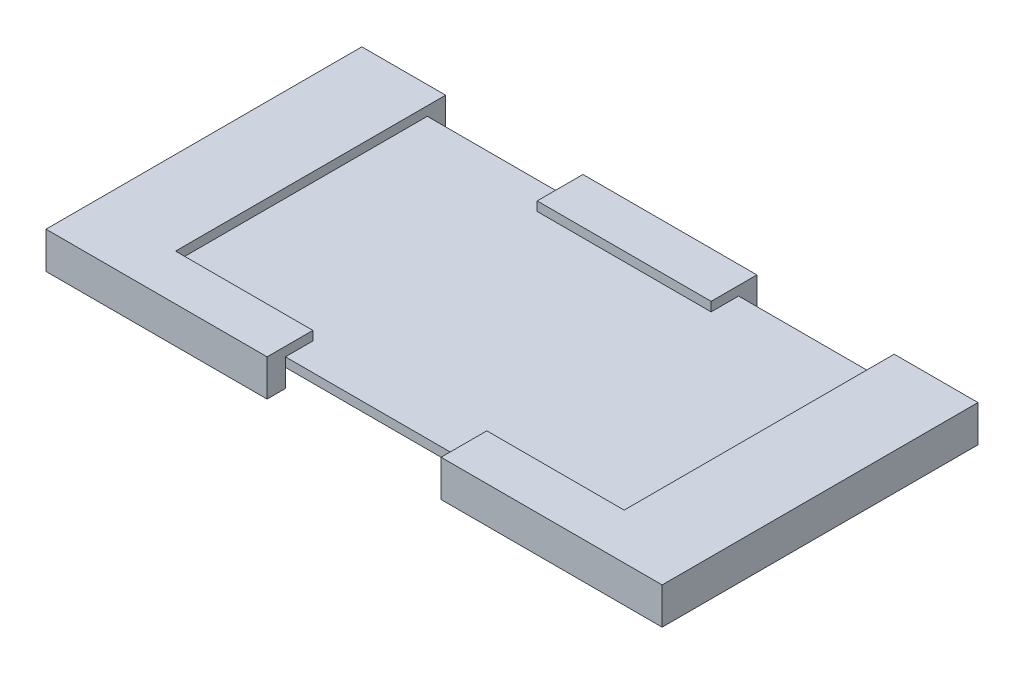
ISO-10303-21;
HEADER;
FILE_DESCRIPTION(('STEP AP214'),'2;1');
FILE_NAME('part.step','',(''),(''),'','','');
FILE_SCHEMA(('AUTOMOTIVE_DESIGN { 1 0 10303 214 1 1 1 1 }'));
ENDSEC;
DATA;
#1=APPLICATION_CONTEXT('core data for automotive mechanical design processes');
#2=APPLICATION_PROTOCOL_DEFINITION('international standard','automotive_design',2000,#1);
#3=PRODUCT_CONTEXT('',#1,'mechanical');
#4=PRODUCT('Part','Part','',(#3));
#5=PRODUCT_RELATED_PRODUCT_CATEGORY('part','',(#4));
#6=PRODUCT_DEFINITION_FORMATION('','',#4);
#7=PRODUCT_DEFINITION_CONTEXT('part definition',#1,'design');
#8=PRODUCT_DEFINITION('design','',#6,#7);
#9=PRODUCT_DEFINITION_SHAPE('','',#8);
#10=(LENGTH_UNIT() NAMED_UNIT(*) SI_UNIT(.MILLI.,.METRE.));
#11=(NAMED_UNIT(*) PLANE_ANGLE_UNIT() SI_UNIT($,.RADIAN.));
#12=(NAMED_UNIT(*) SI_UNIT($,.STERADIAN.) SOLID_ANGLE_UNIT());
#13=UNCERTAINTY_MEASURE_WITH_UNIT(LENGTH_MEASURE(1.E-05),#10,'distance_accuracy_value','');
#14=(GEOMETRIC_REPRESENTATION_CONTEXT(3) GLOBAL_UNCERTAINTY_ASSIGNED_CONTEXT((#13)) GLOBAL_UNIT_ASSIGNED_CONTEXT((#10,
#11,#12)) REPRESENTATION_CONTEXT('',''));
#15=CARTESIAN_POINT('',(0.,0.,0.));
#16=DIRECTION('',(0.,0.,1.));
#17=DIRECTION('',(1.,0.,0.));
#18=AXIS2_PLACEMENT_3D('',#15,#16,#17);
#19=CARTESIAN_POINT('',(0.,0.,0.));
#20=DIRECTION('',(0.,-1.,0.));
#21=DIRECTION('',(0.,0.,-1.));
#22=AXIS2_PLACEMENT_3D('',#19,#20,#21);
#23=PLANE('',#22);
#24=DIRECTION('',(0.,0.,1.));
#25=VECTOR('',#24,1.);
#26=CARTESIAN_POINT('',(-9.49999999999999,0.,15.25));
#27=LINE('',#26,#25);
#28=CARTESIAN_POINT('',(-9.49999999999999,0.,15.25));
#29=VERTEX_POINT('',#28);
#30=CARTESIAN_POINT('',(-9.49999999999999,0.,17.25));
#31=VERTEX_POINT('',#30);
#32=EDGE_CURVE('E224',#29,#31,#27,.T.);
#33=ORIENTED_EDGE('',*,*,#32,.T.);
#34=DIRECTION('',(1.,0.,0.));
#35=VECTOR('',#34,1.);
#36=CARTESIAN_POINT('',(-33.65,0.,17.25));
#37=LINE('',#36,#35);
#38=CARTESIAN_POINT('',(-33.65,0.,17.25));
#39=VERTEX_POINT('',#38);
#40=EDGE_CURVE('E332',#39,#31,#37,.T.);
#41=ORIENTED_EDGE('',*,*,#40,.F.);
#42=DIRECTION('',(0.,0.,1.));
#43=VECTOR('',#42,1.);
#44=CARTESIAN_POINT('',(-33.65,0.,17.25));
#45=LINE('',#44,#43);
#46=CARTESIAN_POINT('',(-33.65,0.,-17.25));
#47=VERTEX_POINT('',#46);
#48=EDGE_CURVE('E350',#47,#39,#45,.T.);
#49=ORIENTED_EDGE('',*,*,#48,.F.);
#50=DIRECTION('',(-1.,0.,0.));
#51=VECTOR('',#50,1.);
#52=CARTESIAN_POINT('',(-33.65,0.,-17.25));
#53=LINE('',#52,#51);
#54=CARTESIAN_POINT('',(-24.5,0.,-17.25));
#55=VERTEX_POINT('',#54);
#56=EDGE_CURVE('E346',#55,#47,#53,.T.);
#57=ORIENTED_EDGE('',*,*,#56,.F.);
#58=DIRECTION('',(0.,0.,-1.));
#59=VECTOR('',#58,1.);
#60=CARTESIAN_POINT('',(-24.5,0.,-15.25));
#61=LINE('',#60,#59);
#62=CARTESIAN_POINT('',(-24.5,0.,-15.25));
#63=VERTEX_POINT('',#62);
#64=EDGE_CURVE('E404',#63,#55,#61,.T.);
#65=ORIENTED_EDGE('',*,*,#64,.F.);
#66=DIRECTION('',(1.,0.,0.));
#67=VECTOR('',#66,1.);
#68=CARTESIAN_POINT('',(31.65,0.,-15.25));
#69=LINE('',#68,#67);
#70=CARTESIAN_POINT('',(-31.65,0.,-15.25));
#71=VERTEX_POINT('',#70);
#72=EDGE_CURVE('E260',#71,#63,#69,.T.);
#73=ORIENTED_EDGE('',*,*,#72,.F.);
#74=DIRECTION('',(0.,0.,-1.));
#75=VECTOR('',#74,1.);
#76=CARTESIAN_POINT('',(-31.65,0.,-15.25));
#77=LINE('',#76,#75);
#78=CARTESIAN_POINT('',(-31.65,0.,15.25));
#79=VERTEX_POINT('',#78);
#80=EDGE_CURVE('E249',#79,#71,#77,.T.);
#81=ORIENTED_EDGE('',*,*,#80,.F.);
#82=DIRECTION('',(-1.,0.,0.));
#83=VECTOR('',#82,1.);
#84=CARTESIAN_POINT('',(31.65,0.,15.25));
#85=LINE('',#84,#83);
#86=EDGE_CURVE('E240',#29,#79,#85,.T.);
#87=ORIENTED_EDGE('',*,*,#86,.F.);
#88=EDGE_LOOP('',(#33,#41,#49,#57,#65,#73,#81,#87));
#89=FACE_BOUND('',#88,.T.);
#90=ADVANCED_FACE('F33',(#89),#23,.T.);
#91=CARTESIAN_POINT('',(0.,3.,0.));
#92=DIRECTION('',(0.,1.,0.));
#93=DIRECTION('',(0.,0.,1.));
#94=AXIS2_PLACEMENT_3D('',#91,#92,#93);
#95=PLANE('',#94);
#96=DIRECTION('',(0.,0.,1.));
#97=VECTOR('',#96,1.);
#98=CARTESIAN_POINT('',(-9.49999999999999,3.,17.25));
#99=LINE('',#98,#97);
#100=CARTESIAN_POINT('',(-9.49999999999999,3.,12.25));
#101=VERTEX_POINT('',#100);
#102=CARTESIAN_POINT('',(-9.49999999999999,3.,15.25));
#103=VERTEX_POINT('',#102);
#104=EDGE_CURVE('E476',#101,#103,#99,.T.);
#105=ORIENTED_EDGE('',*,*,#104,.T.);
#106=DIRECTION('',(-1.,0.,0.));
#107=VECTOR('',#106,1.);
#108=CARTESIAN_POINT('',(-9.49999999999999,3.,15.25));
#109=LINE('',#108,#107);
#110=CARTESIAN_POINT('',(9.50000000000001,3.,15.25));
#111=VERTEX_POINT('',#110);
#112=EDGE_CURVE('E48',#111,#103,#109,.T.);
#113=ORIENTED_EDGE('',*,*,#112,.F.);
#114=DIRECTION('',(0.,0.,-1.));
#115=VECTOR('',#114,1.);
#116=CARTESIAN_POINT('',(9.50000000000001,3.,17.25));
#117=LINE('',#116,#115);
#118=CARTESIAN_POINT('',(9.50000000000001,3.,12.25));
#119=VERTEX_POINT('',#118);
#120=EDGE_CURVE('E482',#111,#119,#117,.T.);
#121=ORIENTED_EDGE('',*,*,#120,.T.);
#122=DIRECTION('',(1.,0.,0.));
#123=VECTOR('',#122,1.);
#124=CARTESIAN_POINT('',(9.50000000000001,3.,12.25));
#125=LINE('',#124,#123);
#126=CARTESIAN_POINT('',(24.5,3.,12.25));
#127=VERTEX_POINT('',#126);
#128=EDGE_CURVE('E306',#119,#127,#125,.T.);
#129=ORIENTED_EDGE('',*,*,#128,.T.);
#130=DIRECTION('',(0.,0.,-1.));
#131=VECTOR('',#130,1.);
#132=CARTESIAN_POINT('',(24.5,3.,-17.25));
#133=LINE('',#132,#131);
#134=CARTESIAN_POINT('',(24.5,3.,-15.25));
#135=VERTEX_POINT('',#134);
#136=EDGE_CURVE('E310',#127,#135,#133,.T.);
#137=ORIENTED_EDGE('',*,*,#136,.T.);
#138=DIRECTION('',(1.,0.,0.));
#139=VECTOR('',#138,1.);
#140=CARTESIAN_POINT('',(24.5,3.,-15.25));
#141=LINE('',#140,#139);
#142=CARTESIAN_POINT('',(9.50000000000001,3.,-15.25));
#143=VERTEX_POINT('',#142);
#144=EDGE_CURVE('E443',#143,#135,#141,.T.);
#145=ORIENTED_EDGE('',*,*,#144,.F.);
#146=DIRECTION('',(0.,0.,1.));
#147=VECTOR('',#146,1.);
#148=CARTESIAN_POINT('',(9.50000000000001,3.,-17.25));
#149=LINE('',#148,#147);
#150=CARTESIAN_POINT('',(9.50000000000001,3.,-12.25));
#151=VERTEX_POINT('',#150);
#152=EDGE_CURVE('E303',#143,#151,#149,.T.);
#153=ORIENTED_EDGE('',*,*,#152,.T.);
#154=DIRECTION('',(-1.,0.,0.));
#155=VECTOR('',#154,1.);
#156=CARTESIAN_POINT('',(9.50000000000001,3.,-12.25));
#157=LINE('',#156,#155);
#158=CARTESIAN_POINT('',(-9.49999999999999,3.,-12.25));
#159=VERTEX_POINT('',#158);
#160=EDGE_CURVE('E479',#151,#159,#157,.T.);
#161=ORIENTED_EDGE('',*,*,#160,.T.);
#162=DIRECTION('',(0.,0.,-1.));
#163=VECTOR('',#162,1.);
#164=CARTESIAN_POINT('',(-9.49999999999999,3.,-17.25));
#165=LINE('',#164,#163);
#166=CARTESIAN_POINT('',(-9.49999999999999,3.,-15.25));
#167=VERTEX_POINT('',#166);
#168=EDGE_CURVE('E283',#159,#167,#165,.T.);
#169=ORIENTED_EDGE('',*,*,#168,.T.);
#170=DIRECTION('',(1.,0.,0.));
#171=VECTOR('',#170,1.);
#172=CARTESIAN_POINT('',(-9.49999999999999,3.,-15.25));
#173=LINE('',#172,#171);
#174=CARTESIAN_POINT('',(-24.5,3.,-15.25));
#175=VERTEX_POINT('',#174);
#176=EDGE_CURVE('E405',#175,#167,#173,.T.);
#177=ORIENTED_EDGE('',*,*,#176,.F.);
#178=DIRECTION('',(0.,0.,1.));
#179=VECTOR('',#178,1.);
#180=CARTESIAN_POINT('',(-24.5,3.,-17.25));
#181=LINE('',#180,#179);
#182=CARTESIAN_POINT('',(-24.5,3.,12.25));
#183=VERTEX_POINT('',#182);
#184=EDGE_CURVE('E277',#175,#183,#181,.T.);
#185=ORIENTED_EDGE('',*,*,#184,.T.);
#186=DIRECTION('',(1.,0.,0.));
#187=VECTOR('',#186,1.);
#188=CARTESIAN_POINT('',(-24.5,3.,12.25));
#189=LINE('',#188,#187);
#190=EDGE_CURVE('E279',#183,#101,#189,.T.);
#191=ORIENTED_EDGE('',*,*,#190,.T.);
#192=EDGE_LOOP('',(#105,#113,#121,#129,#137,#145,#153,#161,#169,#177,#185,#191));
#193=FACE_BOUND('',#192,.T.);
#194=ADVANCED_FACE('F467',(#193),#95,.T.);
#195=CARTESIAN_POINT('',(-33.65,4.,17.25));
#196=DIRECTION('',(0.,0.,-1.));
#197=DIRECTION('',(-1.,0.,0.));
#198=AXIS2_PLACEMENT_3D('',#195,#196,#197);
#199=PLANE('',#198);
#200=ORIENTED_EDGE('',*,*,#40,.T.);
#201=DIRECTION('',(0.,1.,0.));
#202=VECTOR('',#201,1.);
#203=CARTESIAN_POINT('',(-9.49999999999999,3.,17.25));
#204=LINE('',#203,#202);
#205=CARTESIAN_POINT('',(-9.49999999999999,4.,17.25));
#206=VERTEX_POINT('',#205);
#207=EDGE_CURVE('E229',#31,#206,#204,.T.);
#208=ORIENTED_EDGE('',*,*,#207,.T.);
#209=DIRECTION('',(1.,0.,0.));
#210=VECTOR('',#209,1.);
#211=CARTESIAN_POINT('',(-33.65,4.,17.25));
#212=LINE('',#211,#210);
#213=CARTESIAN_POINT('',(-33.65,4.,17.25));
#214=VERTEX_POINT('',#213);
#215=EDGE_CURVE('E340',#214,#206,#212,.T.);
#216=ORIENTED_EDGE('',*,*,#215,.F.);
#217=DIRECTION('',(0.,-1.,0.));
#218=VECTOR('',#217,1.);
#219=CARTESIAN_POINT('',(-33.65,4.,17.25));
#220=LINE('',#219,#218);
#221=EDGE_CURVE('E357',#214,#39,#220,.T.);
#222=ORIENTED_EDGE('',*,*,#221,.T.);
#223=EDGE_LOOP('',(#200,#208,#216,#222));
#224=FACE_BOUND('',#223,.T.);
#225=ADVANCED_FACE('F371',(#224),#199,.F.);
#226=CARTESIAN_POINT('',(31.65,2.,15.25));
#227=DIRECTION('',(0.,0.,1.));
#228=DIRECTION('',(1.,0.,0.));
#229=AXIS2_PLACEMENT_3D('',#226,#227,#228);
#230=PLANE('',#229);
#231=DIRECTION('',(-1.,0.,0.));
#232=VECTOR('',#231,1.);
#233=CARTESIAN_POINT('',(31.65,2.,15.25));
#234=LINE('',#233,#232);
#235=CARTESIAN_POINT('',(-9.49999999999999,2.,15.25));
#236=VERTEX_POINT('',#235);
#237=CARTESIAN_POINT('',(-31.65,2.,15.25));
#238=VERTEX_POINT('',#237);
#239=EDGE_CURVE('E242',#236,#238,#234,.T.);
#240=ORIENTED_EDGE('',*,*,#239,.F.);
#241=DIRECTION('',(0.,-1.,0.));
#242=VECTOR('',#241,1.);
#243=CARTESIAN_POINT('',(-9.49999999999999,3.,15.25));
#244=LINE('',#243,#242);
#245=EDGE_CURVE('E227',#236,#29,#244,.T.);
#246=ORIENTED_EDGE('',*,*,#245,.T.);
#247=ORIENTED_EDGE('',*,*,#86,.T.);
#248=DIRECTION('',(0.,-1.,0.));
#249=VECTOR('',#248,1.);
#250=CARTESIAN_POINT('',(-31.65,2.,15.25));
#251=LINE('',#250,#249);
#252=EDGE_CURVE('E271',#238,#79,#251,.T.);
#253=ORIENTED_EDGE('',*,*,#252,.F.);
#254=EDGE_LOOP('',(#240,#246,#247,#253));
#255=FACE_BOUND('',#254,.T.);
#256=ADVANCED_FACE('F238',(#255),#230,.F.);
#257=CARTESIAN_POINT('',(0.,4.,0.));
#258=DIRECTION('',(0.,-1.,0.));
#259=DIRECTION('',(0.,0.,-1.));
#260=AXIS2_PLACEMENT_3D('',#257,#258,#259);
#261=PLANE('',#260);
#262=DIRECTION('',(1.,0.,0.));
#263=VECTOR('',#262,1.);
#264=CARTESIAN_POINT('',(9.50000000000001,4.,12.25));
#265=LINE('',#264,#263);
#266=CARTESIAN_POINT('',(9.50000000000001,4.,12.25));
#267=VERTEX_POINT('',#266);
#268=CARTESIAN_POINT('',(24.5,4.,12.25));
#269=VERTEX_POINT('',#268);
#270=EDGE_CURVE('E316',#267,#269,#265,.T.);
#271=ORIENTED_EDGE('',*,*,#270,.F.);
#272=DIRECTION('',(0.,0.,-1.));
#273=VECTOR('',#272,1.);
#274=CARTESIAN_POINT('',(9.50000000000001,4.,17.25));
#275=LINE('',#274,#273);
#276=CARTESIAN_POINT('',(9.50000000000001,4.,17.25));
#277=VERTEX_POINT('',#276);
#278=EDGE_CURVE('E486',#277,#267,#275,.T.);
#279=ORIENTED_EDGE('',*,*,#278,.F.);
#280=CARTESIAN_POINT('',(33.65,4.,17.25));
#281=VERTEX_POINT('',#280);
#282=EDGE_CURVE('E339',#277,#281,#212,.T.);
#283=ORIENTED_EDGE('',*,*,#282,.T.);
#284=DIRECTION('',(0.,0.,-1.));
#285=VECTOR('',#284,1.);
#286=CARTESIAN_POINT('',(33.65,4.,17.25));
#287=LINE('',#286,#285);
#288=CARTESIAN_POINT('',(33.65,4.,-17.25));
#289=VERTEX_POINT('',#288);
#290=EDGE_CURVE('E328',#281,#289,#287,.T.);
#291=ORIENTED_EDGE('',*,*,#290,.T.);
#292=DIRECTION('',(-1.,0.,0.));
#293=VECTOR('',#292,1.);
#294=CARTESIAN_POINT('',(-33.65,4.,-17.25));
#295=LINE('',#294,#293);
#296=CARTESIAN_POINT('',(24.5,4.,-17.25));
#297=VERTEX_POINT('',#296);
#298=EDGE_CURVE('E333',#289,#297,#295,.T.);
#299=ORIENTED_EDGE('',*,*,#298,.T.);
#300=DIRECTION('',(0.,0.,-1.));
#301=VECTOR('',#300,1.);
#302=CARTESIAN_POINT('',(24.5,4.,-17.25));
#303=LINE('',#302,#301);
#304=EDGE_CURVE('E307',#269,#297,#303,.T.);
#305=ORIENTED_EDGE('',*,*,#304,.F.);
#306=EDGE_LOOP('',(#271,#279,#283,#291,#299,#305));
#307=FACE_BOUND('',#306,.T.);
#308=ADVANCED_FACE('F538',(#307),#261,.F.);
#309=ORIENTED_EDGE('',*,*,#215,.T.);
#310=DIRECTION('',(0.,0.,1.));
#311=VECTOR('',#310,1.);
#312=CARTESIAN_POINT('',(-9.49999999999999,4.,17.25));
#313=LINE('',#312,#311);
#314=CARTESIAN_POINT('',(-9.49999999999999,4.,12.25));
#315=VERTEX_POINT('',#314);
#316=EDGE_CURVE('E377',#315,#206,#313,.T.);
#317=ORIENTED_EDGE('',*,*,#316,.F.);
#318=DIRECTION('',(1.,0.,0.));
#319=VECTOR('',#318,1.);
#320=CARTESIAN_POINT('',(-24.5,4.,12.25));
#321=LINE('',#320,#319);
#322=CARTESIAN_POINT('',(-24.5,4.,12.25));
#323=VERTEX_POINT('',#322);
#324=EDGE_CURVE('E288',#323,#315,#321,.T.);
#325=ORIENTED_EDGE('',*,*,#324,.F.);
#326=DIRECTION('',(0.,0.,1.));
#327=VECTOR('',#326,1.);
#328=CARTESIAN_POINT('',(-24.5,4.,-17.25));
#329=LINE('',#328,#327);
#330=CARTESIAN_POINT('',(-24.5,4.,-17.25));
#331=VERTEX_POINT('',#330);
#332=EDGE_CURVE('E286',#331,#323,#329,.T.);
#333=ORIENTED_EDGE('',*,*,#332,.F.);
#334=CARTESIAN_POINT('',(-33.65,4.,-17.25));
#335=VERTEX_POINT('',#334);
#336=EDGE_CURVE('E331',#331,#335,#295,.T.);
#337=ORIENTED_EDGE('',*,*,#336,.T.);
#338=DIRECTION('',(0.,0.,1.));
#339=VECTOR('',#338,1.);
#340=CARTESIAN_POINT('',(-33.65,4.,17.25));
#341=LINE('',#340,#339);
#342=EDGE_CURVE('E336',#335,#214,#341,.T.);
#343=ORIENTED_EDGE('',*,*,#342,.T.);
#344=EDGE_LOOP('',(#309,#317,#325,#333,#337,#343));
#345=FACE_BOUND('',#344,.T.);
#346=ADVANCED_FACE('F375',(#345),#261,.F.);
#347=CARTESIAN_POINT('',(-33.65,4.,-17.25));
#348=DIRECTION('',(0.,0.,1.));
#349=DIRECTION('',(1.,0.,0.));
#350=AXIS2_PLACEMENT_3D('',#347,#348,#349);
#351=PLANE('',#350);
#352=CARTESIAN_POINT('',(33.65,0.,-17.25));
#353=VERTEX_POINT('',#352);
#354=CARTESIAN_POINT('',(24.5,0.,-17.25));
#355=VERTEX_POINT('',#354);
#356=EDGE_CURVE('E347',#353,#355,#53,.T.);
#357=ORIENTED_EDGE('',*,*,#356,.T.);
#358=DIRECTION('',(0.,1.,0.));
#359=VECTOR('',#358,1.);
#360=CARTESIAN_POINT('',(24.5,3.,-17.25));
#361=LINE('',#360,#359);
#362=EDGE_CURVE('E321',#355,#297,#361,.T.);
#363=ORIENTED_EDGE('',*,*,#362,.T.);
#364=ORIENTED_EDGE('',*,*,#298,.F.);
#365=DIRECTION('',(0.,-1.,0.));
#366=VECTOR('',#365,1.);
#367=CARTESIAN_POINT('',(33.65,4.,-17.25));
#368=LINE('',#367,#366);
#369=EDGE_CURVE('E11',#289,#353,#368,.T.);
#370=ORIENTED_EDGE('',*,*,#369,.T.);
#371=EDGE_LOOP('',(#357,#363,#364,#370));
#372=FACE_BOUND('',#371,.T.);
#373=ADVANCED_FACE('F540',(#372),#351,.F.);
#374=DIRECTION('',(0.,1.,0.));
#375=VECTOR('',#374,1.);
#376=CARTESIAN_POINT('',(9.50000000000001,3.,-17.25));
#377=LINE('',#376,#375);
#378=CARTESIAN_POINT('',(9.50000000000001,0.,-17.25));
#379=VERTEX_POINT('',#378);
#380=CARTESIAN_POINT('',(9.50000000000001,4.,-17.25));
#381=VERTEX_POINT('',#380);
#382=EDGE_CURVE('E289',#379,#381,#377,.T.);
#383=ORIENTED_EDGE('',*,*,#382,.F.);
#384=CARTESIAN_POINT('',(-9.49999999999999,0.,-17.25));
#385=VERTEX_POINT('',#384);
#386=EDGE_CURVE('E351',#379,#385,#53,.T.);
#387=ORIENTED_EDGE('',*,*,#386,.T.);
#388=DIRECTION('',(0.,1.,0.));
#389=VECTOR('',#388,1.);
#390=CARTESIAN_POINT('',(-9.49999999999999,3.,-17.25));
#391=LINE('',#390,#389);
#392=CARTESIAN_POINT('',(-9.49999999999999,4.,-17.25));
#393=VERTEX_POINT('',#392);
#394=EDGE_CURVE('E296',#385,#393,#391,.T.);
#395=ORIENTED_EDGE('',*,*,#394,.T.);
#396=EDGE_CURVE('E337',#381,#393,#295,.T.);
#397=ORIENTED_EDGE('',*,*,#396,.F.);
#398=EDGE_LOOP('',(#383,#387,#395,#397));
#399=FACE_BOUND('',#398,.T.);
#400=ADVANCED_FACE('F387',(#399),#351,.F.);
#401=DIRECTION('',(0.,0.,1.));
#402=VECTOR('',#401,1.);
#403=CARTESIAN_POINT('',(9.50000000000001,0.,15.25));
#404=LINE('',#403,#402);
#405=CARTESIAN_POINT('',(9.50000000000001,0.,15.25));
#406=VERTEX_POINT('',#405);
#407=CARTESIAN_POINT('',(9.50000000000001,0.,17.25));
#408=VERTEX_POINT('',#407);
#409=EDGE_CURVE('E234',#406,#408,#404,.T.);
#410=ORIENTED_EDGE('',*,*,#409,.F.);
#411=CARTESIAN_POINT('',(31.65,0.,15.25));
#412=VERTEX_POINT('',#411);
#413=EDGE_CURVE('E250',#412,#406,#85,.T.);
#414=ORIENTED_EDGE('',*,*,#413,.F.);
#415=DIRECTION('',(0.,0.,1.));
#416=VECTOR('',#415,1.);
#417=CARTESIAN_POINT('',(31.65,0.,-15.25));
#418=LINE('',#417,#416);
#419=CARTESIAN_POINT('',(31.65,0.,-15.25));
#420=VERTEX_POINT('',#419);
#421=EDGE_CURVE('E251',#420,#412,#418,.T.);
#422=ORIENTED_EDGE('',*,*,#421,.F.);
#423=CARTESIAN_POINT('',(24.5,0.,-15.25));
#424=VERTEX_POINT('',#423);
#425=EDGE_CURVE('E259',#424,#420,#69,.T.);
#426=ORIENTED_EDGE('',*,*,#425,.F.);
#427=DIRECTION('',(0.,0.,-1.));
#428=VECTOR('',#427,1.);
#429=CARTESIAN_POINT('',(24.5,0.,-15.25));
#430=LINE('',#429,#428);
#431=EDGE_CURVE('E446',#424,#355,#430,.T.);
#432=ORIENTED_EDGE('',*,*,#431,.T.);
#433=ORIENTED_EDGE('',*,*,#356,.F.);
#434=DIRECTION('',(0.,0.,-1.));
#435=VECTOR('',#434,1.);
#436=CARTESIAN_POINT('',(33.65,0.,17.25));
#437=LINE('',#436,#435);
#438=CARTESIAN_POINT('',(33.65,0.,17.25));
#439=VERTEX_POINT('',#438);
#440=EDGE_CURVE('E295',#439,#353,#437,.T.);
#441=ORIENTED_EDGE('',*,*,#440,.F.);
#442=EDGE_CURVE('E353',#408,#439,#37,.T.);
#443=ORIENTED_EDGE('',*,*,#442,.F.);
#444=EDGE_LOOP('',(#410,#414,#422,#426,#432,#433,#441,#443));
#445=FACE_BOUND('',#444,.T.);
#446=ADVANCED_FACE('F512',(#445),#23,.T.);
#447=CARTESIAN_POINT('',(31.65,2.,-15.25));
#448=DIRECTION('',(0.,0.,-1.));
#449=DIRECTION('',(-1.,0.,0.));
#450=AXIS2_PLACEMENT_3D('',#447,#448,#449);
#451=PLANE('',#450);
#452=DIRECTION('',(1.,0.,0.));
#453=VECTOR('',#452,1.);
#454=CARTESIAN_POINT('',(31.65,2.,-15.25));
#455=LINE('',#454,#453);
#456=CARTESIAN_POINT('',(24.5,2.,-15.25));
#457=VERTEX_POINT('',#456);
#458=CARTESIAN_POINT('',(31.65,2.,-15.25));
#459=VERTEX_POINT('',#458);
#460=EDGE_CURVE('E422',#457,#459,#455,.T.);
#461=ORIENTED_EDGE('',*,*,#460,.F.);
#462=DIRECTION('',(0.,-1.,0.));
#463=VECTOR('',#462,1.);
#464=CARTESIAN_POINT('',(24.5,3.,-15.25));
#465=LINE('',#464,#463);
#466=EDGE_CURVE('E408',#457,#424,#465,.T.);
#467=ORIENTED_EDGE('',*,*,#466,.T.);
#468=ORIENTED_EDGE('',*,*,#425,.T.);
#469=DIRECTION('',(0.,-1.,0.));
#470=VECTOR('',#469,1.);
#471=CARTESIAN_POINT('',(31.65,2.,-15.25));
#472=LINE('',#471,#470);
#473=EDGE_CURVE('E265',#459,#420,#472,.T.);
#474=ORIENTED_EDGE('',*,*,#473,.F.);
#475=EDGE_LOOP('',(#461,#467,#468,#474));
#476=FACE_BOUND('',#475,.T.);
#477=ADVANCED_FACE('F508',(#476),#451,.F.);
#478=CARTESIAN_POINT('',(-9.49999999999999,0.,-15.25));
#479=VERTEX_POINT('',#478);
#480=CARTESIAN_POINT('',(9.50000000000001,0.,-15.25));
#481=VERTEX_POINT('',#480);
#482=EDGE_CURVE('E264',#479,#481,#69,.T.);
#483=ORIENTED_EDGE('',*,*,#482,.T.);
#484=DIRECTION('',(0.,1.,0.));
#485=VECTOR('',#484,1.);
#486=CARTESIAN_POINT('',(9.50000000000001,3.,-15.25));
#487=LINE('',#486,#485);
#488=CARTESIAN_POINT('',(9.50000000000001,2.,-15.25));
#489=VERTEX_POINT('',#488);
#490=EDGE_CURVE('E440',#481,#489,#487,.T.);
#491=ORIENTED_EDGE('',*,*,#490,.T.);
#492=CARTESIAN_POINT('',(-9.49999999999999,2.,-15.25));
#493=VERTEX_POINT('',#492);
#494=EDGE_CURVE('E428',#493,#489,#455,.T.);
#495=ORIENTED_EDGE('',*,*,#494,.F.);
#496=DIRECTION('',(0.,-1.,0.));
#497=VECTOR('',#496,1.);
#498=CARTESIAN_POINT('',(-9.49999999999999,3.,-15.25));
#499=LINE('',#498,#497);
#500=EDGE_CURVE('E439',#493,#479,#499,.T.);
#501=ORIENTED_EDGE('',*,*,#500,.T.);
#502=EDGE_LOOP('',(#483,#491,#495,#501));
#503=FACE_BOUND('',#502,.T.);
#504=ADVANCED_FACE('F438',(#503),#451,.F.);
#505=CARTESIAN_POINT('',(33.65,4.,17.25));
#506=DIRECTION('',(-1.,0.,0.));
#507=DIRECTION('',(0.,0.,1.));
#508=AXIS2_PLACEMENT_3D('',#505,#506,#507);
#509=PLANE('',#508);
#510=ORIENTED_EDGE('',*,*,#440,.T.);
#511=ORIENTED_EDGE('',*,*,#369,.F.);
#512=ORIENTED_EDGE('',*,*,#290,.F.);
#513=DIRECTION('',(0.,-1.,0.));
#514=VECTOR('',#513,1.);
#515=CARTESIAN_POINT('',(33.65,4.,17.25));
#516=LINE('',#515,#514);
#517=EDGE_CURVE('E343',#281,#439,#516,.T.);
#518=ORIENTED_EDGE('',*,*,#517,.T.);
#519=EDGE_LOOP('',(#510,#511,#512,#518));
#520=FACE_BOUND('',#519,.T.);
#521=ADVANCED_FACE('F35',(#520),#509,.F.);
#522=DIRECTION('',(0.,1.,0.));
#523=VECTOR('',#522,1.);
#524=CARTESIAN_POINT('',(-24.5,3.,-17.25));
#525=LINE('',#524,#523);
#526=EDGE_CURVE('E293',#55,#331,#525,.T.);
#527=ORIENTED_EDGE('',*,*,#526,.F.);
#528=ORIENTED_EDGE('',*,*,#56,.T.);
#529=DIRECTION('',(0.,-1.,0.));
#530=VECTOR('',#529,1.);
#531=CARTESIAN_POINT('',(-33.65,4.,-17.25));
#532=LINE('',#531,#530);
#533=EDGE_CURVE('E41',#335,#47,#532,.T.);
#534=ORIENTED_EDGE('',*,*,#533,.F.);
#535=ORIENTED_EDGE('',*,*,#336,.F.);
#536=EDGE_LOOP('',(#527,#528,#534,#535));
#537=FACE_BOUND('',#536,.T.);
#538=ADVANCED_FACE('F557',(#537),#351,.F.);
#539=CARTESIAN_POINT('',(-33.65,4.,17.25));
#540=DIRECTION('',(1.,0.,0.));
#541=DIRECTION('',(0.,0.,-1.));
#542=AXIS2_PLACEMENT_3D('',#539,#540,#541);
#543=PLANE('',#542);
#544=ORIENTED_EDGE('',*,*,#48,.T.);
#545=ORIENTED_EDGE('',*,*,#221,.F.);
#546=ORIENTED_EDGE('',*,*,#342,.F.);
#547=ORIENTED_EDGE('',*,*,#533,.T.);
#548=EDGE_LOOP('',(#544,#545,#546,#547));
#549=FACE_BOUND('',#548,.T.);
#550=ADVANCED_FACE('F364',(#549),#543,.F.);
#551=DIRECTION('',(0.,1.,0.));
#552=VECTOR('',#551,1.);
#553=CARTESIAN_POINT('',(9.50000000000001,3.,17.25));
#554=LINE('',#553,#552);
#555=EDGE_CURVE('E491',#408,#277,#554,.T.);
#556=ORIENTED_EDGE('',*,*,#555,.F.);
#557=ORIENTED_EDGE('',*,*,#442,.T.);
#558=ORIENTED_EDGE('',*,*,#517,.F.);
#559=ORIENTED_EDGE('',*,*,#282,.F.);
#560=EDGE_LOOP('',(#556,#557,#558,#559));
#561=FACE_BOUND('',#560,.T.);
#562=ADVANCED_FACE('F549',(#561),#199,.F.);
#563=DIRECTION('',(0.,0.,-1.));
#564=VECTOR('',#563,1.);
#565=CARTESIAN_POINT('',(-9.49999999999999,4.,-17.25));
#566=LINE('',#565,#564);
#567=CARTESIAN_POINT('',(-9.49999999999999,4.,-12.25));
#568=VERTEX_POINT('',#567);
#569=EDGE_CURVE('E280',#568,#393,#566,.T.);
#570=ORIENTED_EDGE('',*,*,#569,.F.);
#571=DIRECTION('',(-1.,0.,0.));
#572=VECTOR('',#571,1.);
#573=CARTESIAN_POINT('',(9.50000000000001,4.,-12.25));
#574=LINE('',#573,#572);
#575=CARTESIAN_POINT('',(9.50000000000001,4.,-12.25));
#576=VERTEX_POINT('',#575);
#577=EDGE_CURVE('E488',#576,#568,#574,.T.);
#578=ORIENTED_EDGE('',*,*,#577,.F.);
#579=DIRECTION('',(0.,0.,1.));
#580=VECTOR('',#579,1.);
#581=CARTESIAN_POINT('',(9.50000000000001,4.,-17.25));
#582=LINE('',#581,#580);
#583=EDGE_CURVE('E268',#381,#576,#582,.T.);
#584=ORIENTED_EDGE('',*,*,#583,.F.);
#585=ORIENTED_EDGE('',*,*,#396,.T.);
#586=EDGE_LOOP('',(#570,#578,#584,#585));
#587=FACE_BOUND('',#586,.T.);
#588=ADVANCED_FACE('F384',(#587),#261,.F.);
#589=DIRECTION('',(0.,0.,-1.));
#590=VECTOR('',#589,1.);
#591=CARTESIAN_POINT('',(9.50000000000001,0.,-15.25));
#592=LINE('',#591,#590);
#593=EDGE_CURVE('E254',#481,#379,#592,.T.);
#594=ORIENTED_EDGE('',*,*,#593,.F.);
#595=ORIENTED_EDGE('',*,*,#482,.F.);
#596=DIRECTION('',(0.,0.,-1.));
#597=VECTOR('',#596,1.);
#598=CARTESIAN_POINT('',(-9.49999999999999,0.,-15.25));
#599=LINE('',#598,#597);
#600=EDGE_CURVE('E396',#479,#385,#599,.T.);
#601=ORIENTED_EDGE('',*,*,#600,.T.);
#602=ORIENTED_EDGE('',*,*,#386,.F.);
#603=EDGE_LOOP('',(#594,#595,#601,#602));
#604=FACE_BOUND('',#603,.T.);
#605=ADVANCED_FACE('F402',(#604),#23,.T.);
#606=CARTESIAN_POINT('',(9.50000000000001,3.,-17.25));
#607=DIRECTION('',(-1.,0.,0.));
#608=DIRECTION('',(0.,0.,1.));
#609=AXIS2_PLACEMENT_3D('',#606,#607,#608);
#610=PLANE('',#609);
#611=ORIENTED_EDGE('',*,*,#583,.T.);
#612=DIRECTION('',(0.,1.,0.));
#613=VECTOR('',#612,1.);
#614=CARTESIAN_POINT('',(9.50000000000001,3.,-12.25));
#615=LINE('',#614,#613);
#616=EDGE_CURVE('E478',#151,#576,#615,.T.);
#617=ORIENTED_EDGE('',*,*,#616,.F.);
#618=ORIENTED_EDGE('',*,*,#152,.F.);
#619=EDGE_CURVE('E444',#489,#143,#487,.T.);
#620=ORIENTED_EDGE('',*,*,#619,.F.);
#621=ORIENTED_EDGE('',*,*,#490,.F.);
#622=ORIENTED_EDGE('',*,*,#593,.T.);
#623=ORIENTED_EDGE('',*,*,#382,.T.);
#624=EDGE_LOOP('',(#611,#617,#618,#620,#621,#622,#623));
#625=FACE_BOUND('',#624,.T.);
#626=ADVANCED_FACE('F499',(#625),#610,.F.);
#627=CARTESIAN_POINT('',(24.5,3.,-17.25));
#628=DIRECTION('',(1.,0.,0.));
#629=DIRECTION('',(0.,0.,-1.));
#630=AXIS2_PLACEMENT_3D('',#627,#628,#629);
#631=PLANE('',#630);
#632=ORIENTED_EDGE('',*,*,#304,.T.);
#633=ORIENTED_EDGE('',*,*,#362,.F.);
#634=ORIENTED_EDGE('',*,*,#431,.F.);
#635=ORIENTED_EDGE('',*,*,#466,.F.);
#636=EDGE_CURVE('E56',#135,#457,#465,.T.);
#637=ORIENTED_EDGE('',*,*,#636,.F.);
#638=ORIENTED_EDGE('',*,*,#136,.F.);
#639=DIRECTION('',(0.,1.,0.));
#640=VECTOR('',#639,1.);
#641=CARTESIAN_POINT('',(24.5,3.,12.25));
#642=LINE('',#641,#640);
#643=EDGE_CURVE('E324',#127,#269,#642,.T.);
#644=ORIENTED_EDGE('',*,*,#643,.T.);
#645=EDGE_LOOP('',(#632,#633,#634,#635,#637,#638,#644));
#646=FACE_BOUND('',#645,.T.);
#647=ADVANCED_FACE('F504',(#646),#631,.F.);
#648=CARTESIAN_POINT('',(9.50000000000001,3.,12.25));
#649=DIRECTION('',(0.,0.,1.));
#650=DIRECTION('',(1.,0.,0.));
#651=AXIS2_PLACEMENT_3D('',#648,#649,#650);
#652=PLANE('',#651);
#653=ORIENTED_EDGE('',*,*,#270,.T.);
#654=ORIENTED_EDGE('',*,*,#643,.F.);
#655=ORIENTED_EDGE('',*,*,#128,.F.);
#656=DIRECTION('',(0.,1.,0.));
#657=VECTOR('',#656,1.);
#658=CARTESIAN_POINT('',(9.50000000000001,3.,12.25));
#659=LINE('',#658,#657);
#660=EDGE_CURVE('E313',#119,#267,#659,.T.);
#661=ORIENTED_EDGE('',*,*,#660,.T.);
#662=EDGE_LOOP('',(#653,#654,#655,#661));
#663=FACE_BOUND('',#662,.T.);
#664=ADVANCED_FACE('F535',(#663),#652,.F.);
#665=CARTESIAN_POINT('',(-24.5,3.,-17.25));
#666=DIRECTION('',(-1.,0.,0.));
#667=DIRECTION('',(0.,0.,1.));
#668=AXIS2_PLACEMENT_3D('',#665,#666,#667);
#669=PLANE('',#668);
#670=ORIENTED_EDGE('',*,*,#332,.T.);
#671=DIRECTION('',(0.,1.,0.));
#672=VECTOR('',#671,1.);
#673=CARTESIAN_POINT('',(-24.5,3.,12.25));
#674=LINE('',#673,#672);
#675=EDGE_CURVE('E285',#183,#323,#674,.T.);
#676=ORIENTED_EDGE('',*,*,#675,.F.);
#677=ORIENTED_EDGE('',*,*,#184,.F.);
#678=DIRECTION('',(0.,1.,0.));
#679=VECTOR('',#678,1.);
#680=CARTESIAN_POINT('',(-24.5,3.,-15.25));
#681=LINE('',#680,#679);
#682=CARTESIAN_POINT('',(-24.5,2.,-15.25));
#683=VERTEX_POINT('',#682);
#684=EDGE_CURVE('E456',#683,#175,#681,.T.);
#685=ORIENTED_EDGE('',*,*,#684,.F.);
#686=EDGE_CURVE('E411',#63,#683,#681,.T.);
#687=ORIENTED_EDGE('',*,*,#686,.F.);
#688=ORIENTED_EDGE('',*,*,#64,.T.);
#689=ORIENTED_EDGE('',*,*,#526,.T.);
#690=EDGE_LOOP('',(#670,#676,#677,#685,#687,#688,#689));
#691=FACE_BOUND('',#690,.T.);
#692=ADVANCED_FACE('F471',(#691),#669,.F.);
#693=CARTESIAN_POINT('',(-9.49999999999999,3.,-17.25));
#694=DIRECTION('',(1.,0.,0.));
#695=DIRECTION('',(0.,0.,-1.));
#696=AXIS2_PLACEMENT_3D('',#693,#694,#695);
#697=PLANE('',#696);
#698=ORIENTED_EDGE('',*,*,#168,.F.);
#699=DIRECTION('',(0.,1.,0.));
#700=VECTOR('',#699,1.);
#701=CARTESIAN_POINT('',(-9.49999999999999,3.,-12.25));
#702=LINE('',#701,#700);
#703=EDGE_CURVE('E481',#159,#568,#702,.T.);
#704=ORIENTED_EDGE('',*,*,#703,.T.);
#705=ORIENTED_EDGE('',*,*,#569,.T.);
#706=ORIENTED_EDGE('',*,*,#394,.F.);
#707=ORIENTED_EDGE('',*,*,#600,.F.);
#708=ORIENTED_EDGE('',*,*,#500,.F.);
#709=EDGE_CURVE('E454',#167,#493,#499,.T.);
#710=ORIENTED_EDGE('',*,*,#709,.F.);
#711=EDGE_LOOP('',(#698,#704,#705,#706,#707,#708,#710));
#712=FACE_BOUND('',#711,.T.);
#713=ADVANCED_FACE('F394',(#712),#697,.F.);
#714=CARTESIAN_POINT('',(-24.5,3.,12.25));
#715=DIRECTION('',(0.,0.,1.));
#716=DIRECTION('',(1.,0.,0.));
#717=AXIS2_PLACEMENT_3D('',#714,#715,#716);
#718=PLANE('',#717);
#719=ORIENTED_EDGE('',*,*,#324,.T.);
#720=DIRECTION('',(0.,1.,0.));
#721=VECTOR('',#720,1.);
#722=CARTESIAN_POINT('',(-9.49999999999999,3.,12.25));
#723=LINE('',#722,#721);
#724=EDGE_CURVE('E299',#101,#315,#723,.T.);
#725=ORIENTED_EDGE('',*,*,#724,.F.);
#726=ORIENTED_EDGE('',*,*,#190,.F.);
#727=ORIENTED_EDGE('',*,*,#675,.T.);
#728=EDGE_LOOP('',(#719,#725,#726,#727));
#729=FACE_BOUND('',#728,.T.);
#730=ADVANCED_FACE('F475',(#729),#718,.F.);
#731=CARTESIAN_POINT('',(31.65,2.,-15.25));
#732=DIRECTION('',(1.,0.,0.));
#733=DIRECTION('',(0.,0.,-1.));
#734=AXIS2_PLACEMENT_3D('',#731,#732,#733);
#735=PLANE('',#734);
#736=ORIENTED_EDGE('',*,*,#421,.T.);
#737=DIRECTION('',(0.,-1.,0.));
#738=VECTOR('',#737,1.);
#739=CARTESIAN_POINT('',(31.65,2.,15.25));
#740=LINE('',#739,#738);
#741=CARTESIAN_POINT('',(31.65,2.,15.25));
#742=VERTEX_POINT('',#741);
#743=EDGE_CURVE('E273',#742,#412,#740,.T.);
#744=ORIENTED_EDGE('',*,*,#743,.F.);
#745=DIRECTION('',(0.,0.,1.));
#746=VECTOR('',#745,1.);
#747=CARTESIAN_POINT('',(31.65,2.,-15.25));
#748=LINE('',#747,#746);
#749=EDGE_CURVE('E263',#459,#742,#748,.T.);
#750=ORIENTED_EDGE('',*,*,#749,.F.);
#751=ORIENTED_EDGE('',*,*,#473,.T.);
#752=EDGE_LOOP('',(#736,#744,#750,#751));
#753=FACE_BOUND('',#752,.T.);
#754=ADVANCED_FACE('F515',(#753),#735,.F.);
#755=ORIENTED_EDGE('',*,*,#72,.T.);
#756=ORIENTED_EDGE('',*,*,#686,.T.);
#757=CARTESIAN_POINT('',(-31.65,2.,-15.25));
#758=VERTEX_POINT('',#757);
#759=EDGE_CURVE('E276',#758,#683,#455,.T.);
#760=ORIENTED_EDGE('',*,*,#759,.F.);
#761=DIRECTION('',(0.,-1.,0.));
#762=VECTOR('',#761,1.);
#763=CARTESIAN_POINT('',(-31.65,2.,-15.25));
#764=LINE('',#763,#762);
#765=EDGE_CURVE('E269',#758,#71,#764,.T.);
#766=ORIENTED_EDGE('',*,*,#765,.T.);
#767=EDGE_LOOP('',(#755,#756,#760,#766));
#768=FACE_BOUND('',#767,.T.);
#769=ADVANCED_FACE('F587',(#768),#451,.F.);
#770=CARTESIAN_POINT('',(-31.65,2.,-15.25));
#771=DIRECTION('',(-1.,0.,0.));
#772=DIRECTION('',(0.,0.,1.));
#773=AXIS2_PLACEMENT_3D('',#770,#771,#772);
#774=PLANE('',#773);
#775=ORIENTED_EDGE('',*,*,#80,.T.);
#776=ORIENTED_EDGE('',*,*,#765,.F.);
#777=DIRECTION('',(0.,0.,-1.));
#778=VECTOR('',#777,1.);
#779=CARTESIAN_POINT('',(-31.65,2.,-15.25));
#780=LINE('',#779,#778);
#781=EDGE_CURVE('E419',#238,#758,#780,.T.);
#782=ORIENTED_EDGE('',*,*,#781,.F.);
#783=ORIENTED_EDGE('',*,*,#252,.T.);
#784=EDGE_LOOP('',(#775,#776,#782,#783));
#785=FACE_BOUND('',#784,.T.);
#786=ADVANCED_FACE('F590',(#785),#774,.F.);
#787=ORIENTED_EDGE('',*,*,#413,.T.);
#788=DIRECTION('',(0.,1.,0.));
#789=VECTOR('',#788,1.);
#790=CARTESIAN_POINT('',(9.50000000000001,3.,15.25));
#791=LINE('',#790,#789);
#792=CARTESIAN_POINT('',(9.50000000000001,2.,15.25));
#793=VERTEX_POINT('',#792);
#794=EDGE_CURVE('E521',#406,#793,#791,.T.);
#795=ORIENTED_EDGE('',*,*,#794,.T.);
#796=EDGE_CURVE('E416',#742,#793,#234,.T.);
#797=ORIENTED_EDGE('',*,*,#796,.F.);
#798=ORIENTED_EDGE('',*,*,#743,.T.);
#799=EDGE_LOOP('',(#787,#795,#797,#798));
#800=FACE_BOUND('',#799,.T.);
#801=ADVANCED_FACE('F519',(#800),#230,.F.);
#802=CARTESIAN_POINT('',(0.,2.,0.));
#803=DIRECTION('',(0.,-1.,0.));
#804=DIRECTION('',(0.,0.,-1.));
#805=AXIS2_PLACEMENT_3D('',#802,#803,#804);
#806=PLANE('',#805);
#807=ORIENTED_EDGE('',*,*,#749,.T.);
#808=ORIENTED_EDGE('',*,*,#796,.T.);
#809=EDGE_CURVE('E420',#793,#236,#234,.T.);
#810=ORIENTED_EDGE('',*,*,#809,.T.);
#811=ORIENTED_EDGE('',*,*,#239,.T.);
#812=ORIENTED_EDGE('',*,*,#781,.T.);
#813=ORIENTED_EDGE('',*,*,#759,.T.);
#814=EDGE_CURVE('E424',#683,#493,#455,.T.);
#815=ORIENTED_EDGE('',*,*,#814,.T.);
#816=ORIENTED_EDGE('',*,*,#494,.T.);
#817=EDGE_CURVE('E429',#489,#457,#455,.T.);
#818=ORIENTED_EDGE('',*,*,#817,.T.);
#819=ORIENTED_EDGE('',*,*,#460,.T.);
#820=EDGE_LOOP('',(#807,#808,#810,#811,#812,#813,#815,#816,#818,#819));
#821=FACE_BOUND('',#820,.T.);
#822=ADVANCED_FACE('F435',(#821),#806,.T.);
#823=CARTESIAN_POINT('',(0.,0.,-15.25));
#824=DIRECTION('',(0.,0.,-1.));
#825=DIRECTION('',(-1.,0.,0.));
#826=AXIS2_PLACEMENT_3D('',#823,#824,#825);
#827=PLANE('',#826);
#828=ORIENTED_EDGE('',*,*,#684,.T.);
#829=ORIENTED_EDGE('',*,*,#176,.T.);
#830=ORIENTED_EDGE('',*,*,#709,.T.);
#831=ORIENTED_EDGE('',*,*,#814,.F.);
#832=EDGE_LOOP('',(#828,#829,#830,#831));
#833=FACE_BOUND('',#832,.T.);
#834=ADVANCED_FACE('F462',(#833),#827,.T.);
#835=CARTESIAN_POINT('',(0.,0.,-15.25));
#836=DIRECTION('',(0.,0.,-1.));
#837=DIRECTION('',(-1.,0.,0.));
#838=AXIS2_PLACEMENT_3D('',#835,#836,#837);
#839=PLANE('',#838);
#840=ORIENTED_EDGE('',*,*,#619,.T.);
#841=ORIENTED_EDGE('',*,*,#144,.T.);
#842=ORIENTED_EDGE('',*,*,#636,.T.);
#843=ORIENTED_EDGE('',*,*,#817,.F.);
#844=EDGE_LOOP('',(#840,#841,#842,#843));
#845=FACE_BOUND('',#844,.T.);
#846=ADVANCED_FACE('F500',(#845),#839,.T.);
#847=CARTESIAN_POINT('',(9.50000000000001,3.,17.25));
#848=DIRECTION('',(1.,0.,0.));
#849=DIRECTION('',(0.,0.,-1.));
#850=AXIS2_PLACEMENT_3D('',#847,#848,#849);
#851=PLANE('',#850);
#852=ORIENTED_EDGE('',*,*,#120,.F.);
#853=EDGE_CURVE('E524',#793,#111,#791,.T.);
#854=ORIENTED_EDGE('',*,*,#853,.F.);
#855=ORIENTED_EDGE('',*,*,#794,.F.);
#856=ORIENTED_EDGE('',*,*,#409,.T.);
#857=ORIENTED_EDGE('',*,*,#555,.T.);
#858=ORIENTED_EDGE('',*,*,#278,.T.);
#859=ORIENTED_EDGE('',*,*,#660,.F.);
#860=EDGE_LOOP('',(#852,#854,#855,#856,#857,#858,#859));
#861=FACE_BOUND('',#860,.T.);
#862=ADVANCED_FACE('F526',(#861),#851,.F.);
#863=CARTESIAN_POINT('',(-9.49999999999999,3.,17.25));
#864=DIRECTION('',(-1.,0.,0.));
#865=DIRECTION('',(0.,0.,1.));
#866=AXIS2_PLACEMENT_3D('',#863,#864,#865);
#867=PLANE('',#866);
#868=ORIENTED_EDGE('',*,*,#316,.T.);
#869=ORIENTED_EDGE('',*,*,#207,.F.);
#870=ORIENTED_EDGE('',*,*,#32,.F.);
#871=ORIENTED_EDGE('',*,*,#245,.F.);
#872=EDGE_CURVE('E244',#103,#236,#244,.T.);
#873=ORIENTED_EDGE('',*,*,#872,.F.);
#874=ORIENTED_EDGE('',*,*,#104,.F.);
#875=ORIENTED_EDGE('',*,*,#724,.T.);
#876=EDGE_LOOP('',(#868,#869,#870,#871,#873,#874,#875));
#877=FACE_BOUND('',#876,.T.);
#878=ADVANCED_FACE('F226',(#877),#867,.F.);
#879=CARTESIAN_POINT('',(9.50000000000001,3.,-12.25));
#880=DIRECTION('',(0.,0.,-1.));
#881=DIRECTION('',(-1.,0.,0.));
#882=AXIS2_PLACEMENT_3D('',#879,#880,#881);
#883=PLANE('',#882);
#884=ORIENTED_EDGE('',*,*,#577,.T.);
#885=ORIENTED_EDGE('',*,*,#703,.F.);
#886=ORIENTED_EDGE('',*,*,#160,.F.);
#887=ORIENTED_EDGE('',*,*,#616,.T.);
#888=EDGE_LOOP('',(#884,#885,#886,#887));
#889=FACE_BOUND('',#888,.T.);
#890=ADVANCED_FACE('F495',(#889),#883,.F.);
#891=CARTESIAN_POINT('',(0.,0.,15.25));
#892=DIRECTION('',(0.,0.,1.));
#893=DIRECTION('',(1.,0.,0.));
#894=AXIS2_PLACEMENT_3D('',#891,#892,#893);
#895=PLANE('',#894);
#896=ORIENTED_EDGE('',*,*,#853,.T.);
#897=ORIENTED_EDGE('',*,*,#112,.T.);
#898=ORIENTED_EDGE('',*,*,#872,.T.);
#899=ORIENTED_EDGE('',*,*,#809,.F.);
#900=EDGE_LOOP('',(#896,#897,#898,#899));
#901=FACE_BOUND('',#900,.T.);
#902=ADVANCED_FACE('F523',(#901),#895,.T.);
#903=CLOSED_SHELL('',(#90,#194,#225,#256,#308,#346,#373,#400,#446,#477,#504,#521,#538,#550,#562,
#588,#605,#626,#647,#664,#692,#713,#730,#754,#769,#786,#801,#822,#834,#846,#862,#878,#890,#902));
#904=MANIFOLD_SOLID_BREP('B2',#903);
#905=ADVANCED_BREP_SHAPE_REPRESENTATION('',(#18,#904),#14);
#906=SHAPE_DEFINITION_REPRESENTATION(#9,#905);
ENDSEC;
END-ISO-10303-21;
